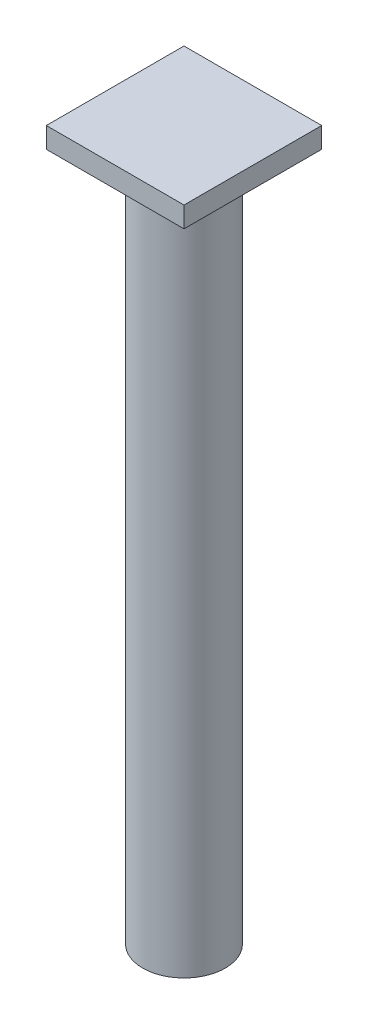
ISO-10303-21;
HEADER;
FILE_DESCRIPTION(('STEP AP214'),'2;1');
FILE_NAME('part.step','',(''),(''),'','','');
FILE_SCHEMA(('AUTOMOTIVE_DESIGN { 1 0 10303 214 1 1 1 1 }'));
ENDSEC;
DATA;
#1=APPLICATION_CONTEXT('core data for automotive mechanical design processes');
#2=APPLICATION_PROTOCOL_DEFINITION('international standard','automotive_design',2000,#1);
#3=PRODUCT_CONTEXT('',#1,'mechanical');
#4=PRODUCT('Part','Part','',(#3));
#5=PRODUCT_RELATED_PRODUCT_CATEGORY('part','',(#4));
#6=PRODUCT_DEFINITION_FORMATION('','',#4);
#7=PRODUCT_DEFINITION_CONTEXT('part definition',#1,'design');
#8=PRODUCT_DEFINITION('design','',#6,#7);
#9=PRODUCT_DEFINITION_SHAPE('','',#8);
#10=(LENGTH_UNIT() NAMED_UNIT(*) SI_UNIT(.MILLI.,.METRE.));
#11=(NAMED_UNIT(*) PLANE_ANGLE_UNIT() SI_UNIT($,.RADIAN.));
#12=(NAMED_UNIT(*) SI_UNIT($,.STERADIAN.) SOLID_ANGLE_UNIT());
#13=UNCERTAINTY_MEASURE_WITH_UNIT(LENGTH_MEASURE(1.E-05),#10,'distance_accuracy_value','');
#14=(GEOMETRIC_REPRESENTATION_CONTEXT(3) GLOBAL_UNCERTAINTY_ASSIGNED_CONTEXT((#13)) GLOBAL_UNIT_ASSIGNED_CONTEXT((#10,
#11,#12)) REPRESENTATION_CONTEXT('',''));
#15=CARTESIAN_POINT('',(0.,0.,0.));
#16=DIRECTION('',(0.,0.,1.));
#17=DIRECTION('',(1.,0.,0.));
#18=AXIS2_PLACEMENT_3D('',#15,#16,#17);
#19=CARTESIAN_POINT('',(0.,500.,0.));
#20=DIRECTION('',(0.,-1.,0.));
#21=DIRECTION('',(0.,0.,-1.));
#22=AXIS2_PLACEMENT_3D('',#19,#20,#21);
#23=CYLINDRICAL_SURFACE('',#22,30.);
#24=CARTESIAN_POINT('',(0.,500.,0.));
#25=DIRECTION('',(0.,1.,0.));
#26=DIRECTION('',(0.,0.,1.));
#27=AXIS2_PLACEMENT_3D('',#24,#25,#26);
#28=CIRCLE('',#27,30.);
#29=CARTESIAN_POINT('',(0.,500.,30.));
#30=VERTEX_POINT('',#29);
#31=EDGE_CURVE('E11',#30,#30,#28,.T.);
#32=ORIENTED_EDGE('',*,*,#31,.F.);
#33=EDGE_LOOP('',(#32));
#34=FACE_BOUND('',#33,.T.);
#35=CARTESIAN_POINT('',(0.,0.,0.));
#36=DIRECTION('',(0.,1.,0.));
#37=DIRECTION('',(0.,0.,1.));
#38=AXIS2_PLACEMENT_3D('',#35,#36,#37);
#39=CIRCLE('',#38,30.);
#40=CARTESIAN_POINT('',(0.,0.,30.));
#41=VERTEX_POINT('',#40);
#42=EDGE_CURVE('E48',#41,#41,#39,.T.);
#43=ORIENTED_EDGE('',*,*,#42,.T.);
#44=EDGE_LOOP('',(#43));
#45=FACE_BOUND('',#44,.T.);
#46=ADVANCED_FACE('F44',(#34,#45),#23,.T.);
#47=CARTESIAN_POINT('',(0.,0.,0.));
#48=DIRECTION('',(0.,1.,0.));
#49=DIRECTION('',(0.,0.,1.));
#50=AXIS2_PLACEMENT_3D('',#47,#48,#49);
#51=PLANE('',#50);
#52=CARTESIAN_POINT('',(0.,0.,0.));
#53=DIRECTION('',(0.,-1.,0.));
#54=DIRECTION('',(0.,0.,-1.));
#55=AXIS2_PLACEMENT_3D('',#52,#53,#54);
#56=CIRCLE('',#55,25.);
#57=CARTESIAN_POINT('',(0.,0.,-25.));
#58=VERTEX_POINT('',#57);
#59=EDGE_CURVE('E134',#58,#58,#56,.T.);
#60=ORIENTED_EDGE('',*,*,#59,.F.);
#61=EDGE_LOOP('',(#60));
#62=FACE_BOUND('',#61,.T.);
#63=ORIENTED_EDGE('',*,*,#42,.F.);
#64=EDGE_LOOP('',(#63));
#65=FACE_BOUND('',#64,.T.);
#66=ADVANCED_FACE('F145',(#62,#65),#51,.F.);
#67=CARTESIAN_POINT('',(0.,100.,0.));
#68=DIRECTION('',(0.,-1.,0.));
#69=DIRECTION('',(0.,0.,-1.));
#70=AXIS2_PLACEMENT_3D('',#67,#68,#69);
#71=CYLINDRICAL_SURFACE('',#70,25.);
#72=CARTESIAN_POINT('',(0.,100.,0.));
#73=DIRECTION('',(0.,-1.,0.));
#74=DIRECTION('',(0.,0.,-1.));
#75=AXIS2_PLACEMENT_3D('',#72,#73,#74);
#76=CIRCLE('',#75,25.);
#77=CARTESIAN_POINT('',(0.,100.,-25.));
#78=VERTEX_POINT('',#77);
#79=EDGE_CURVE('E131',#78,#78,#76,.T.);
#80=ORIENTED_EDGE('',*,*,#79,.F.);
#81=EDGE_LOOP('',(#80));
#82=FACE_BOUND('',#81,.T.);
#83=ORIENTED_EDGE('',*,*,#59,.T.);
#84=EDGE_LOOP('',(#83));
#85=FACE_BOUND('',#84,.T.);
#86=ADVANCED_FACE('F142',(#82,#85),#71,.F.);
#87=CARTESIAN_POINT('',(0.,100.,0.));
#88=DIRECTION('',(0.,-1.,0.));
#89=DIRECTION('',(0.,0.,-1.));
#90=AXIS2_PLACEMENT_3D('',#87,#88,#89);
#91=PLANE('',#90);
#92=ORIENTED_EDGE('',*,*,#79,.T.);
#93=EDGE_LOOP('',(#92));
#94=FACE_BOUND('',#93,.T.);
#95=ADVANCED_FACE('F177',(#94),#91,.T.);
#96=CARTESIAN_POINT('',(50.,515.,-50.));
#97=DIRECTION('',(-1.,0.,0.));
#98=DIRECTION('',(0.,0.,1.));
#99=AXIS2_PLACEMENT_3D('',#96,#97,#98);
#100=PLANE('',#99);
#101=DIRECTION('',(0.,0.,-1.));
#102=VECTOR('',#101,1.);
#103=CARTESIAN_POINT('',(50.,500.,-50.));
#104=LINE('',#103,#102);
#105=CARTESIAN_POINT('',(50.,500.,50.));
#106=VERTEX_POINT('',#105);
#107=CARTESIAN_POINT('',(50.,500.,-50.));
#108=VERTEX_POINT('',#107);
#109=EDGE_CURVE('E120',#106,#108,#104,.T.);
#110=ORIENTED_EDGE('',*,*,#109,.T.);
#111=DIRECTION('',(0.,-1.,0.));
#112=VECTOR('',#111,1.);
#113=CARTESIAN_POINT('',(50.,515.,-50.));
#114=LINE('',#113,#112);
#115=CARTESIAN_POINT('',(50.,515.,-50.));
#116=VERTEX_POINT('',#115);
#117=EDGE_CURVE('E106',#116,#108,#114,.T.);
#118=ORIENTED_EDGE('',*,*,#117,.F.);
#119=DIRECTION('',(0.,0.,-1.));
#120=VECTOR('',#119,1.);
#121=CARTESIAN_POINT('',(50.,515.,-50.));
#122=LINE('',#121,#120);
#123=CARTESIAN_POINT('',(50.,515.,50.));
#124=VERTEX_POINT('',#123);
#125=EDGE_CURVE('E98',#124,#116,#122,.T.);
#126=ORIENTED_EDGE('',*,*,#125,.F.);
#127=DIRECTION('',(0.,-1.,0.));
#128=VECTOR('',#127,1.);
#129=CARTESIAN_POINT('',(50.,515.,50.));
#130=LINE('',#129,#128);
#131=EDGE_CURVE('E114',#124,#106,#130,.T.);
#132=ORIENTED_EDGE('',*,*,#131,.T.);
#133=EDGE_LOOP('',(#110,#118,#126,#132));
#134=FACE_BOUND('',#133,.T.);
#135=ADVANCED_FACE('F162',(#134),#100,.F.);
#136=CARTESIAN_POINT('',(50.,515.,-50.));
#137=DIRECTION('',(0.,0.,1.));
#138=DIRECTION('',(1.,0.,0.));
#139=AXIS2_PLACEMENT_3D('',#136,#137,#138);
#140=PLANE('',#139);
#141=DIRECTION('',(-1.,0.,0.));
#142=VECTOR('',#141,1.);
#143=CARTESIAN_POINT('',(50.,500.,-50.));
#144=LINE('',#143,#142);
#145=CARTESIAN_POINT('',(-50.,500.,-50.));
#146=VERTEX_POINT('',#145);
#147=EDGE_CURVE('E102',#108,#146,#144,.T.);
#148=ORIENTED_EDGE('',*,*,#147,.T.);
#149=DIRECTION('',(0.,-1.,0.));
#150=VECTOR('',#149,1.);
#151=CARTESIAN_POINT('',(-50.,515.,-50.));
#152=LINE('',#151,#150);
#153=CARTESIAN_POINT('',(-50.,515.,-50.));
#154=VERTEX_POINT('',#153);
#155=EDGE_CURVE('E105',#154,#146,#152,.T.);
#156=ORIENTED_EDGE('',*,*,#155,.F.);
#157=DIRECTION('',(-1.,0.,0.));
#158=VECTOR('',#157,1.);
#159=CARTESIAN_POINT('',(50.,515.,-50.));
#160=LINE('',#159,#158);
#161=EDGE_CURVE('E91',#116,#154,#160,.T.);
#162=ORIENTED_EDGE('',*,*,#161,.F.);
#163=ORIENTED_EDGE('',*,*,#117,.T.);
#164=EDGE_LOOP('',(#148,#156,#162,#163));
#165=FACE_BOUND('',#164,.T.);
#166=ADVANCED_FACE('F103',(#165),#140,.F.);
#167=CARTESIAN_POINT('',(-50.,515.,-50.));
#168=DIRECTION('',(1.,0.,0.));
#169=DIRECTION('',(0.,0.,-1.));
#170=AXIS2_PLACEMENT_3D('',#167,#168,#169);
#171=PLANE('',#170);
#172=DIRECTION('',(0.,0.,1.));
#173=VECTOR('',#172,1.);
#174=CARTESIAN_POINT('',(-50.,500.,-50.));
#175=LINE('',#174,#173);
#176=CARTESIAN_POINT('',(-50.,500.,50.));
#177=VERTEX_POINT('',#176);
#178=EDGE_CURVE('E76',#146,#177,#175,.T.);
#179=ORIENTED_EDGE('',*,*,#178,.T.);
#180=DIRECTION('',(0.,-1.,0.));
#181=VECTOR('',#180,1.);
#182=CARTESIAN_POINT('',(-50.,515.,50.));
#183=LINE('',#182,#181);
#184=CARTESIAN_POINT('',(-50.,515.,50.));
#185=VERTEX_POINT('',#184);
#186=EDGE_CURVE('E110',#185,#177,#183,.T.);
#187=ORIENTED_EDGE('',*,*,#186,.F.);
#188=DIRECTION('',(0.,0.,1.));
#189=VECTOR('',#188,1.);
#190=CARTESIAN_POINT('',(-50.,515.,-50.));
#191=LINE('',#190,#189);
#192=EDGE_CURVE('E96',#154,#185,#191,.T.);
#193=ORIENTED_EDGE('',*,*,#192,.F.);
#194=ORIENTED_EDGE('',*,*,#155,.T.);
#195=EDGE_LOOP('',(#179,#187,#193,#194));
#196=FACE_BOUND('',#195,.T.);
#197=ADVANCED_FACE('F108',(#196),#171,.F.);
#198=CARTESIAN_POINT('',(50.,515.,50.));
#199=DIRECTION('',(0.,0.,-1.));
#200=DIRECTION('',(-1.,0.,0.));
#201=AXIS2_PLACEMENT_3D('',#198,#199,#200);
#202=PLANE('',#201);
#203=DIRECTION('',(1.,0.,0.));
#204=VECTOR('',#203,1.);
#205=CARTESIAN_POINT('',(50.,500.,50.));
#206=LINE('',#205,#204);
#207=EDGE_CURVE('E84',#177,#106,#206,.T.);
#208=ORIENTED_EDGE('',*,*,#207,.T.);
#209=ORIENTED_EDGE('',*,*,#131,.F.);
#210=DIRECTION('',(1.,0.,0.));
#211=VECTOR('',#210,1.);
#212=CARTESIAN_POINT('',(50.,515.,50.));
#213=LINE('',#212,#211);
#214=EDGE_CURVE('E65',#185,#124,#213,.T.);
#215=ORIENTED_EDGE('',*,*,#214,.F.);
#216=ORIENTED_EDGE('',*,*,#186,.T.);
#217=EDGE_LOOP('',(#208,#209,#215,#216));
#218=FACE_BOUND('',#217,.T.);
#219=ADVANCED_FACE('F163',(#218),#202,.F.);
#220=CARTESIAN_POINT('',(0.,515.,0.));
#221=DIRECTION('',(0.,-1.,0.));
#222=DIRECTION('',(0.,0.,-1.));
#223=AXIS2_PLACEMENT_3D('',#220,#221,#222);
#224=PLANE('',#223);
#225=ORIENTED_EDGE('',*,*,#125,.T.);
#226=ORIENTED_EDGE('',*,*,#161,.T.);
#227=ORIENTED_EDGE('',*,*,#192,.T.);
#228=ORIENTED_EDGE('',*,*,#214,.T.);
#229=EDGE_LOOP('',(#225,#226,#227,#228));
#230=FACE_BOUND('',#229,.T.);
#231=ADVANCED_FACE('F94',(#230),#224,.F.);
#232=CARTESIAN_POINT('',(0.,500.,0.));
#233=DIRECTION('',(0.,-1.,0.));
#234=DIRECTION('',(0.,0.,-1.));
#235=AXIS2_PLACEMENT_3D('',#232,#233,#234);
#236=PLANE('',#235);
#237=ORIENTED_EDGE('',*,*,#31,.T.);
#238=EDGE_LOOP('',(#237));
#239=FACE_BOUND('',#238,.T.);
#240=ORIENTED_EDGE('',*,*,#109,.F.);
#241=ORIENTED_EDGE('',*,*,#207,.F.);
#242=ORIENTED_EDGE('',*,*,#178,.F.);
#243=ORIENTED_EDGE('',*,*,#147,.F.);
#244=EDGE_LOOP('',(#240,#241,#242,#243));
#245=FACE_BOUND('',#244,.T.);
#246=ADVANCED_FACE('F160',(#239,#245),#236,.T.);
#247=CLOSED_SHELL('',(#46,#66,#86,#95,#135,#166,#197,#219,#231,#246));
#248=MANIFOLD_SOLID_BREP('B2',#247);
#249=ADVANCED_BREP_SHAPE_REPRESENTATION('',(#18,#248),#14);
#250=SHAPE_DEFINITION_REPRESENTATION(#9,#249);
ENDSEC;
END-ISO-10303-21;
